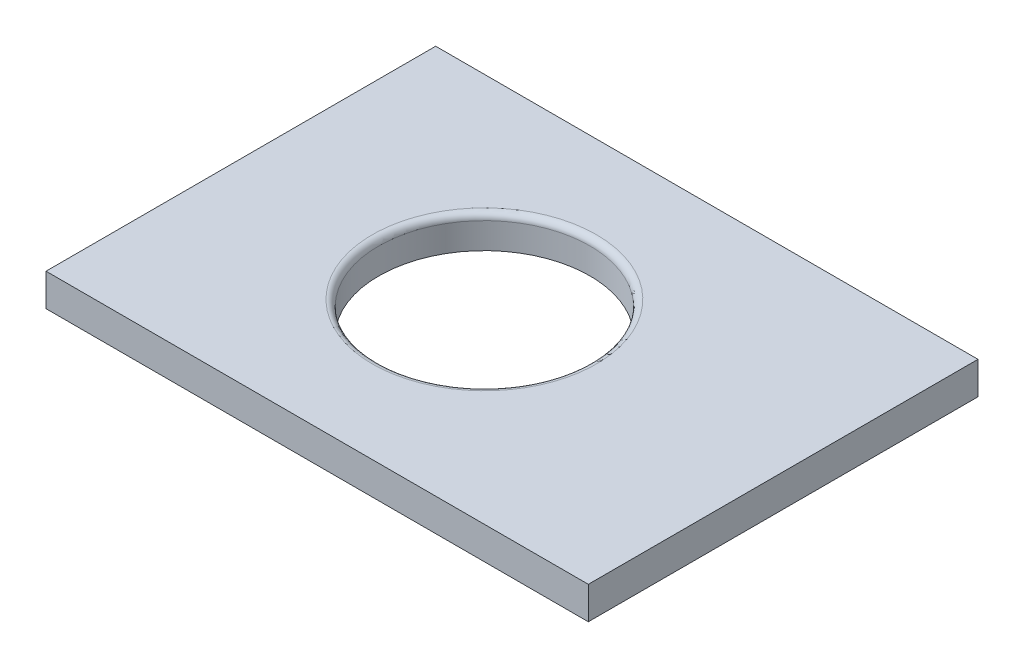
ISO-10303-21;
HEADER;
FILE_DESCRIPTION(('STEP AP214'),'2;1');
FILE_NAME('part.step','',(''),(''),'','','');
FILE_SCHEMA(('AUTOMOTIVE_DESIGN { 1 0 10303 214 1 1 1 1 }'));
ENDSEC;
DATA;
#1=APPLICATION_CONTEXT('core data for automotive mechanical design processes');
#2=APPLICATION_PROTOCOL_DEFINITION('international standard','automotive_design',2000,#1);
#3=PRODUCT_CONTEXT('',#1,'mechanical');
#4=PRODUCT('Part','Part','',(#3));
#5=PRODUCT_RELATED_PRODUCT_CATEGORY('part','',(#4));
#6=PRODUCT_DEFINITION_FORMATION('','',#4);
#7=PRODUCT_DEFINITION_CONTEXT('part definition',#1,'design');
#8=PRODUCT_DEFINITION('design','',#6,#7);
#9=PRODUCT_DEFINITION_SHAPE('','',#8);
#10=(LENGTH_UNIT() NAMED_UNIT(*) SI_UNIT(.MILLI.,.METRE.));
#11=(NAMED_UNIT(*) PLANE_ANGLE_UNIT() SI_UNIT($,.RADIAN.));
#12=(NAMED_UNIT(*) SI_UNIT($,.STERADIAN.) SOLID_ANGLE_UNIT());
#13=UNCERTAINTY_MEASURE_WITH_UNIT(LENGTH_MEASURE(1.E-05),#10,'distance_accuracy_value','');
#14=(GEOMETRIC_REPRESENTATION_CONTEXT(3) GLOBAL_UNCERTAINTY_ASSIGNED_CONTEXT((#13)) GLOBAL_UNIT_ASSIGNED_CONTEXT((#10,
#11,#12)) REPRESENTATION_CONTEXT('',''));
#15=CARTESIAN_POINT('',(0.,0.,0.));
#16=DIRECTION('',(0.,0.,1.));
#17=DIRECTION('',(1.,0.,0.));
#18=AXIS2_PLACEMENT_3D('',#15,#16,#17);
#19=CARTESIAN_POINT('',(-0.849999999999997,0.8,0.));
#20=DIRECTION('',(0.,1.,0.));
#21=DIRECTION('',(0.,0.,1.));
#22=AXIS2_PLACEMENT_3D('',#19,#20,#21);
#23=TOROIDAL_SURFACE('',#22,3.45,0.2);
#24=CARTESIAN_POINT('',(-0.849999999999997,0.8,0.));
#25=DIRECTION('',(0.,1.,0.));
#26=DIRECTION('',(0.,0.,1.));
#27=AXIS2_PLACEMENT_3D('',#24,#25,#26);
#28=CIRCLE('',#27,3.25);
#29=CARTESIAN_POINT('',(-0.849999999999997,0.8,3.25));
#30=VERTEX_POINT('',#29);
#31=EDGE_CURVE('E74',#30,#30,#28,.F.);
#32=ORIENTED_EDGE('',*,*,#31,.T.);
#33=EDGE_LOOP('',(#32));
#34=FACE_BOUND('',#33,.T.);
#35=CARTESIAN_POINT('',(-0.849999999999997,1.,0.));
#36=DIRECTION('',(0.,1.,0.));
#37=DIRECTION('',(0.,0.,1.));
#38=AXIS2_PLACEMENT_3D('',#35,#36,#37);
#39=CIRCLE('',#38,3.45);
#40=CARTESIAN_POINT('',(-0.849999999999996,1.,-3.45));
#41=VERTEX_POINT('',#40);
#42=CARTESIAN_POINT('',(-0.849999999999997,1.,3.45));
#43=VERTEX_POINT('',#42);
#44=EDGE_CURVE('E64',#41,#43,#39,.F.);
#45=ORIENTED_EDGE('',*,*,#44,.F.);
#46=CARTESIAN_POINT('',(-0.849999999999997,1.,0.));
#47=DIRECTION('',(0.,1.,0.));
#48=DIRECTION('',(0.,0.,-1.));
#49=AXIS2_PLACEMENT_3D('',#46,#47,#48);
#50=CIRCLE('',#49,3.45);
#51=EDGE_CURVE('E67',#43,#41,#50,.F.);
#52=ORIENTED_EDGE('',*,*,#51,.F.);
#53=EDGE_LOOP('',(#45,#52));
#54=FACE_BOUND('',#53,.T.);
#55=ADVANCED_FACE('F17',(#34,#54),#23,.T.);
#56=CARTESIAN_POINT('',(0.,1.,0.));
#57=DIRECTION('',(0.,1.,0.));
#58=DIRECTION('',(0.,0.,1.));
#59=AXIS2_PLACEMENT_3D('',#56,#57,#58);
#60=PLANE('',#59);
#61=DIRECTION('',(0.,0.,-1.));
#62=VECTOR('',#61,1.);
#63=CARTESIAN_POINT('',(-8.35,1.,-6.));
#64=LINE('',#63,#62);
#65=CARTESIAN_POINT('',(-8.35,1.,-6.));
#66=VERTEX_POINT('',#65);
#67=CARTESIAN_POINT('',(-8.35,1.,6.));
#68=VERTEX_POINT('',#67);
#69=EDGE_CURVE('E110',#66,#68,#64,.F.);
#70=ORIENTED_EDGE('',*,*,#69,.T.);
#71=DIRECTION('',(-1.,0.,0.));
#72=VECTOR('',#71,1.);
#73=CARTESIAN_POINT('',(-8.35,1.,6.));
#74=LINE('',#73,#72);
#75=CARTESIAN_POINT('',(8.35,1.,6.));
#76=VERTEX_POINT('',#75);
#77=EDGE_CURVE('E105',#68,#76,#74,.F.);
#78=ORIENTED_EDGE('',*,*,#77,.T.);
#79=DIRECTION('',(0.,0.,1.));
#80=VECTOR('',#79,1.);
#81=CARTESIAN_POINT('',(8.35,1.,-6.));
#82=LINE('',#81,#80);
#83=CARTESIAN_POINT('',(8.35,1.,-6.));
#84=VERTEX_POINT('',#83);
#85=EDGE_CURVE('E96',#76,#84,#82,.F.);
#86=ORIENTED_EDGE('',*,*,#85,.T.);
#87=DIRECTION('',(1.,0.,0.));
#88=VECTOR('',#87,1.);
#89=CARTESIAN_POINT('',(-8.35,1.,-6.));
#90=LINE('',#89,#88);
#91=EDGE_CURVE('E114',#84,#66,#90,.F.);
#92=ORIENTED_EDGE('',*,*,#91,.T.);
#93=EDGE_LOOP('',(#70,#78,#86,#92));
#94=FACE_BOUND('',#93,.T.);
#95=ORIENTED_EDGE('',*,*,#51,.T.);
#96=ORIENTED_EDGE('',*,*,#44,.T.);
#97=EDGE_LOOP('',(#95,#96));
#98=FACE_BOUND('',#97,.T.);
#99=ADVANCED_FACE('F69',(#94,#98),#60,.T.);
#100=CARTESIAN_POINT('',(-0.849999999999997,-0.5,0.));
#101=DIRECTION('',(0.,1.,0.));
#102=DIRECTION('',(0.,0.,1.));
#103=AXIS2_PLACEMENT_3D('',#100,#101,#102);
#104=CYLINDRICAL_SURFACE('',#103,3.25);
#105=CARTESIAN_POINT('',(-0.849999999999997,0.,0.));
#106=DIRECTION('',(0.,1.,0.));
#107=DIRECTION('',(0.,0.,1.));
#108=AXIS2_PLACEMENT_3D('',#105,#106,#107);
#109=CIRCLE('',#108,3.25);
#110=CARTESIAN_POINT('',(-0.849999999999997,0.,3.25));
#111=VERTEX_POINT('',#110);
#112=EDGE_CURVE('E81',#111,#111,#109,.F.);
#113=ORIENTED_EDGE('',*,*,#112,.T.);
#114=EDGE_LOOP('',(#113));
#115=FACE_BOUND('',#114,.T.);
#116=ORIENTED_EDGE('',*,*,#31,.F.);
#117=EDGE_LOOP('',(#116));
#118=FACE_BOUND('',#117,.T.);
#119=ADVANCED_FACE('F131',(#115,#118),#104,.F.);
#120=CARTESIAN_POINT('',(-8.35,1.,-6.));
#121=DIRECTION('',(0.,0.,1.));
#122=DIRECTION('',(1.,0.,0.));
#123=AXIS2_PLACEMENT_3D('',#120,#121,#122);
#124=PLANE('',#123);
#125=DIRECTION('',(0.,1.,0.));
#126=VECTOR('',#125,1.);
#127=CARTESIAN_POINT('',(-8.35,1.,-6.));
#128=LINE('',#127,#126);
#129=CARTESIAN_POINT('',(-8.35,0.,-6.));
#130=VERTEX_POINT('',#129);
#131=EDGE_CURVE('E112',#130,#66,#128,.T.);
#132=ORIENTED_EDGE('',*,*,#131,.T.);
#133=ORIENTED_EDGE('',*,*,#91,.F.);
#134=DIRECTION('',(0.,1.,0.));
#135=VECTOR('',#134,1.);
#136=CARTESIAN_POINT('',(8.35,1.,-6.));
#137=LINE('',#136,#135);
#138=CARTESIAN_POINT('',(8.35,0.,-6.));
#139=VERTEX_POINT('',#138);
#140=EDGE_CURVE('E89',#84,#139,#137,.F.);
#141=ORIENTED_EDGE('',*,*,#140,.T.);
#142=DIRECTION('',(1.,0.,0.));
#143=VECTOR('',#142,1.);
#144=CARTESIAN_POINT('',(0.,0.,-6.));
#145=LINE('',#144,#143);
#146=EDGE_CURVE('E88',#139,#130,#145,.F.);
#147=ORIENTED_EDGE('',*,*,#146,.T.);
#148=EDGE_LOOP('',(#132,#133,#141,#147));
#149=FACE_BOUND('',#148,.T.);
#150=ADVANCED_FACE('F142',(#149),#124,.F.);
#151=CARTESIAN_POINT('',(-8.35,1.,-6.));
#152=DIRECTION('',(1.,0.,0.));
#153=DIRECTION('',(0.,0.,-1.));
#154=AXIS2_PLACEMENT_3D('',#151,#152,#153);
#155=PLANE('',#154);
#156=DIRECTION('',(0.,1.,0.));
#157=VECTOR('',#156,1.);
#158=CARTESIAN_POINT('',(-8.35,1.,6.));
#159=LINE('',#158,#157);
#160=CARTESIAN_POINT('',(-8.35,0.,6.));
#161=VERTEX_POINT('',#160);
#162=EDGE_CURVE('E107',#161,#68,#159,.T.);
#163=ORIENTED_EDGE('',*,*,#162,.T.);
#164=ORIENTED_EDGE('',*,*,#69,.F.);
#165=ORIENTED_EDGE('',*,*,#131,.F.);
#166=DIRECTION('',(0.,0.,1.));
#167=VECTOR('',#166,1.);
#168=CARTESIAN_POINT('',(-8.35,0.,0.));
#169=LINE('',#168,#167);
#170=EDGE_CURVE('E93',#130,#161,#169,.T.);
#171=ORIENTED_EDGE('',*,*,#170,.T.);
#172=EDGE_LOOP('',(#163,#164,#165,#171));
#173=FACE_BOUND('',#172,.T.);
#174=ADVANCED_FACE('F145',(#173),#155,.F.);
#175=CARTESIAN_POINT('',(-8.35,1.,6.));
#176=DIRECTION('',(0.,0.,-1.));
#177=DIRECTION('',(-1.,0.,0.));
#178=AXIS2_PLACEMENT_3D('',#175,#176,#177);
#179=PLANE('',#178);
#180=DIRECTION('',(0.,1.,0.));
#181=VECTOR('',#180,1.);
#182=CARTESIAN_POINT('',(8.35,1.,6.));
#183=LINE('',#182,#181);
#184=CARTESIAN_POINT('',(8.35,0.,6.));
#185=VERTEX_POINT('',#184);
#186=EDGE_CURVE('E37',#185,#76,#183,.T.);
#187=ORIENTED_EDGE('',*,*,#186,.T.);
#188=ORIENTED_EDGE('',*,*,#77,.F.);
#189=ORIENTED_EDGE('',*,*,#162,.F.);
#190=DIRECTION('',(1.,0.,0.));
#191=VECTOR('',#190,1.);
#192=CARTESIAN_POINT('',(0.,0.,6.));
#193=LINE('',#192,#191);
#194=EDGE_CURVE('E29',#161,#185,#193,.T.);
#195=ORIENTED_EDGE('',*,*,#194,.T.);
#196=EDGE_LOOP('',(#187,#188,#189,#195));
#197=FACE_BOUND('',#196,.T.);
#198=ADVANCED_FACE('F148',(#197),#179,.F.);
#199=CARTESIAN_POINT('',(8.35,1.,-6.));
#200=DIRECTION('',(-1.,0.,0.));
#201=DIRECTION('',(0.,0.,1.));
#202=AXIS2_PLACEMENT_3D('',#199,#200,#201);
#203=PLANE('',#202);
#204=ORIENTED_EDGE('',*,*,#140,.F.);
#205=ORIENTED_EDGE('',*,*,#85,.F.);
#206=ORIENTED_EDGE('',*,*,#186,.F.);
#207=DIRECTION('',(0.,0.,1.));
#208=VECTOR('',#207,1.);
#209=CARTESIAN_POINT('',(8.35,0.,0.));
#210=LINE('',#209,#208);
#211=EDGE_CURVE('E11',#185,#139,#210,.F.);
#212=ORIENTED_EDGE('',*,*,#211,.T.);
#213=EDGE_LOOP('',(#204,#205,#206,#212));
#214=FACE_BOUND('',#213,.T.);
#215=ADVANCED_FACE('F152',(#214),#203,.F.);
#216=CARTESIAN_POINT('',(0.,0.,0.));
#217=DIRECTION('',(0.,1.,0.));
#218=DIRECTION('',(0.,0.,1.));
#219=AXIS2_PLACEMENT_3D('',#216,#217,#218);
#220=PLANE('',#219);
#221=ORIENTED_EDGE('',*,*,#194,.F.);
#222=ORIENTED_EDGE('',*,*,#170,.F.);
#223=ORIENTED_EDGE('',*,*,#146,.F.);
#224=ORIENTED_EDGE('',*,*,#211,.F.);
#225=EDGE_LOOP('',(#221,#222,#223,#224));
#226=FACE_BOUND('',#225,.T.);
#227=ORIENTED_EDGE('',*,*,#112,.F.);
#228=EDGE_LOOP('',(#227));
#229=FACE_BOUND('',#228,.T.);
#230=ADVANCED_FACE('F156',(#226,#229),#220,.F.);
#231=CLOSED_SHELL('',(#55,#99,#119,#150,#174,#198,#215,#230));
#232=MANIFOLD_SOLID_BREP('B1',#231);
#233=ADVANCED_BREP_SHAPE_REPRESENTATION('',(#18,#232),#14);
#234=SHAPE_DEFINITION_REPRESENTATION(#9,#233);
ENDSEC;
END-ISO-10303-21;
